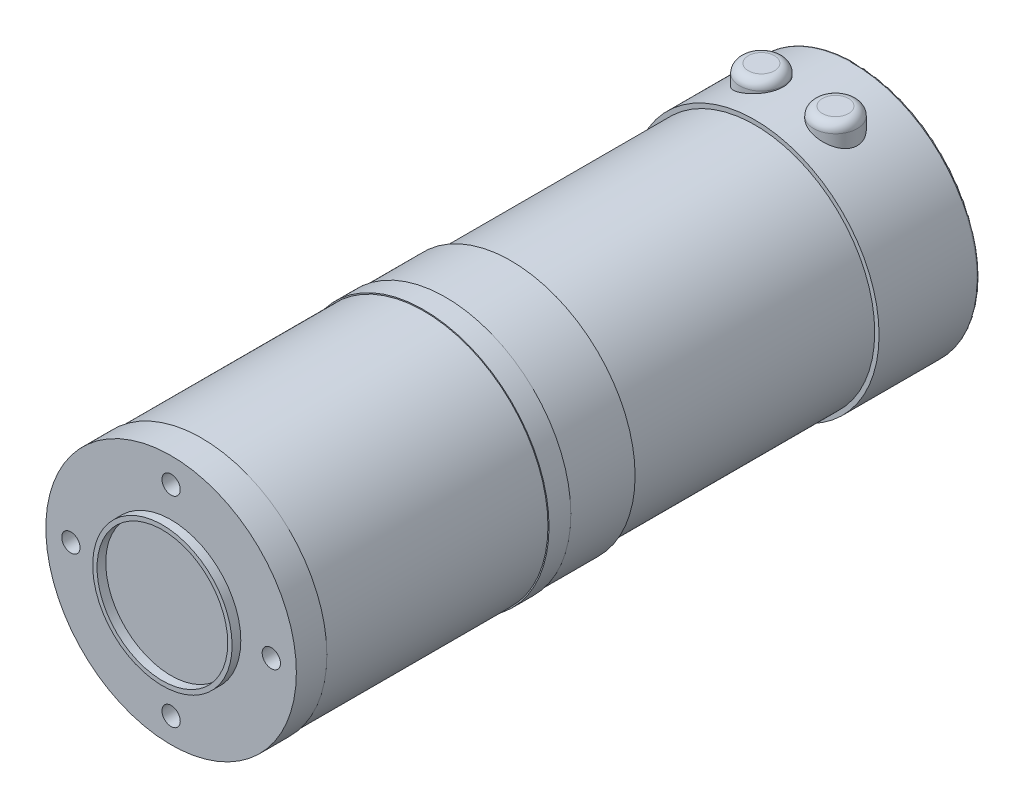
ISO-10303-21;
HEADER;
FILE_DESCRIPTION(('STEP AP214'),'2;1');
FILE_NAME('part.step','',(''),(''),'','','');
FILE_SCHEMA(('AUTOMOTIVE_DESIGN { 1 0 10303 214 1 1 1 1 }'));
ENDSEC;
DATA;
#1=APPLICATION_CONTEXT('core data for automotive mechanical design processes');
#2=APPLICATION_PROTOCOL_DEFINITION('international standard','automotive_design',2000,#1);
#3=PRODUCT_CONTEXT('',#1,'mechanical');
#4=PRODUCT('Part','Part','',(#3));
#5=PRODUCT_RELATED_PRODUCT_CATEGORY('part','',(#4));
#6=PRODUCT_DEFINITION_FORMATION('','',#4);
#7=PRODUCT_DEFINITION_CONTEXT('part definition',#1,'design');
#8=PRODUCT_DEFINITION('design','',#6,#7);
#9=PRODUCT_DEFINITION_SHAPE('','',#8);
#10=(LENGTH_UNIT() NAMED_UNIT(*) SI_UNIT(.MILLI.,.METRE.));
#11=(NAMED_UNIT(*) PLANE_ANGLE_UNIT() SI_UNIT($,.RADIAN.));
#12=(NAMED_UNIT(*) SI_UNIT($,.STERADIAN.) SOLID_ANGLE_UNIT());
#13=UNCERTAINTY_MEASURE_WITH_UNIT(LENGTH_MEASURE(1.E-05),#10,'distance_accuracy_value','');
#14=(GEOMETRIC_REPRESENTATION_CONTEXT(3) GLOBAL_UNCERTAINTY_ASSIGNED_CONTEXT((#13)) GLOBAL_UNIT_ASSIGNED_CONTEXT((#10,
#11,#12)) REPRESENTATION_CONTEXT('',''));
#15=CARTESIAN_POINT('',(0.,0.,0.));
#16=DIRECTION('',(0.,0.,1.));
#17=DIRECTION('',(1.,0.,0.));
#18=AXIS2_PLACEMENT_3D('',#15,#16,#17);
#19=CARTESIAN_POINT('',(0.,0.,23.));
#20=DIRECTION('',(0.,0.,-1.));
#21=DIRECTION('',(-1.,0.,0.));
#22=AXIS2_PLACEMENT_3D('',#19,#20,#21);
#23=CYLINDRICAL_SURFACE('',#22,28.5);
#24=CARTESIAN_POINT('',(8.5,27.2029410174709,18.));
#25=CARTESIAN_POINT('',(8.2215980023257,27.2899288025535,17.9999928920093));
#26=CARTESIAN_POINT('',(7.94175455463476,27.3726393053829,17.9766936688537));
#27=CARTESIAN_POINT('',(7.38702584232357,27.5275291059472,17.8826686358344));
#28=CARTESIAN_POINT('',(7.11214218859442,27.5997050342584,17.8119276923052));
#29=CARTESIAN_POINT('',(6.57540973267578,27.732482006058,17.6235207777951));
#30=CARTESIAN_POINT('',(6.3135820941252,27.7930646809322,17.5057812371101));
#31=CARTESIAN_POINT('',(5.81213291778889,27.9022406462446,17.2258478128532));
#32=CARTESIAN_POINT('',(5.57250769890732,27.9508359263866,17.063661316167));
#33=CARTESIAN_POINT('',(5.13036785518342,28.0353096235172,16.7046265894163));
#34=CARTESIAN_POINT('',(4.92695853245409,28.0715245365877,16.508958414972));
#35=CARTESIAN_POINT('',(4.55534602461994,28.1342216143982,16.0853008481876));
#36=CARTESIAN_POINT('',(4.38714033157915,28.1607044725595,15.857313760216));
#37=CARTESIAN_POINT('',(4.09366047527898,28.204852566088,15.3794088848876));
#38=CARTESIAN_POINT('',(3.96775566879824,28.2226493029743,15.1298901229276));
#39=CARTESIAN_POINT('',(3.75913612694643,28.2511954685276,14.6130317614181));
#40=CARTESIAN_POINT('',(3.67642072233359,28.2619450063952,14.3456924380797));
#41=CARTESIAN_POINT('',(3.55674247638711,28.2772568808793,13.8011422091777));
#42=CARTESIAN_POINT('',(3.51972324755044,28.2818268435445,13.523943904909));
#43=CARTESIAN_POINT('',(3.49234593187339,28.2852208603011,12.9672158688755));
#44=CARTESIAN_POINT('',(3.50198815986978,28.2840448756232,12.6876861213926));
#45=CARTESIAN_POINT('',(3.56768322963313,28.2758326561016,12.133936280986));
#46=CARTESIAN_POINT('',(3.62378255946918,28.2687905511858,11.8597217882658));
#47=CARTESIAN_POINT('',(3.78077844725276,28.2482199536616,11.3246875940557));
#48=CARTESIAN_POINT('',(3.88167458960516,28.234691521229,11.0638677683239));
#49=CARTESIAN_POINT('',(4.12514480027641,28.2001456216817,10.5631809923704));
#50=CARTESIAN_POINT('',(4.26769592220469,28.1791322763733,10.3233026004218));
#51=CARTESIAN_POINT('',(4.59010280470923,28.1284107514337,9.87113468534313));
#52=CARTESIAN_POINT('',(4.76995717226081,28.0987028964668,9.65884413247473));
#53=CARTESIAN_POINT('',(5.16122938959032,28.0294676919833,9.26783439845957));
#54=CARTESIAN_POINT('',(5.37262857825648,27.9899461388822,9.08909550921673));
#55=CARTESIAN_POINT('',(5.82042139361639,27.9002643849483,8.76969258028937));
#56=CARTESIAN_POINT('',(6.0568149207809,27.8501042264784,8.62902838899661));
#57=CARTESIAN_POINT('',(6.54927373225259,27.7384425411735,8.38801285772151));
#58=CARTESIAN_POINT('',(6.8054819453155,27.6768530398525,8.28799485643057));
#59=CARTESIAN_POINT('',(7.32820459405546,27.5430609841584,8.13159559291751));
#60=CARTESIAN_POINT('',(7.59472031634745,27.4708571016944,8.07521979682737));
#61=CARTESIAN_POINT('',(8.13866731132534,27.3147302419548,8.00531658776753));
#62=CARTESIAN_POINT('',(8.41618669140292,27.230521414967,7.99312074054481));
#63=CARTESIAN_POINT('',(8.96692022728644,27.0541688199638,8.01422049783395));
#64=CARTESIAN_POINT('',(9.24013327228207,26.9620230430087,8.04752765160574));
#65=CARTESIAN_POINT('',(9.78947466045829,26.7676170932278,8.16059377829724));
#66=CARTESIAN_POINT('',(10.0650336049574,26.6650805525536,8.24264797509598));
#67=CARTESIAN_POINT('',(10.5974876181209,26.4579861587864,8.45219547755334));
#68=CARTESIAN_POINT('',(10.8543762577636,26.353427624975,8.57970434687915));
#69=CARTESIAN_POINT('',(11.3536419431518,26.1423249483254,8.88351198200938));
#70=CARTESIAN_POINT('',(11.594977544702,26.0358778789205,9.06161249689401));
#71=CARTESIAN_POINT('',(11.9314983939501,25.8825175409181,9.36030019221266));
#72=CARTESIAN_POINT('',(12.0394876537895,25.8324182137753,9.46519844453498));
#73=CARTESIAN_POINT('',(12.2461368335703,25.7350952351465,9.6850077000052));
#74=CARTESIAN_POINT('',(12.3448012161735,25.68787021198,9.79991386249444));
#75=CARTESIAN_POINT('',(12.5298647400655,25.5981025088198,10.0365119599594));
#76=CARTESIAN_POINT('',(12.616484463665,25.5554801675457,10.1580012247675));
#77=CARTESIAN_POINT('',(12.7790436716005,25.4745810781106,10.4092179640949));
#78=CARTESIAN_POINT('',(12.85498841136,25.4363021934152,10.5389413388778));
#79=CARTESIAN_POINT('',(12.9953340060611,25.364887075107,10.8057613434494));
#80=CARTESIAN_POINT('',(13.0597406027344,25.3317482847343,10.9428542615232));
#81=CARTESIAN_POINT('',(13.1762041789068,25.2713662579139,11.2234368302694));
#82=CARTESIAN_POINT('',(13.2282627961067,25.2441222396902,11.3669256296598));
#83=CARTESIAN_POINT('',(13.3146540722985,25.1986531731305,11.6442657852441));
#84=CARTESIAN_POINT('',(13.3502480464709,25.1797941288685,11.7776212880751));
#85=CARTESIAN_POINT('',(13.4103762301415,25.1478224284268,12.0474732582856));
#86=CARTESIAN_POINT('',(13.4349117746185,25.1347090786295,12.1839693444402));
#87=CARTESIAN_POINT('',(13.4725690151559,25.1145444237488,12.4588923407664));
#88=CARTESIAN_POINT('',(13.4856972004214,25.10748967219,12.5973181076179));
#89=CARTESIAN_POINT('',(13.5003683756773,25.0996040968057,12.8749562909521));
#90=CARTESIAN_POINT('',(13.5019121406375,25.0987728566423,13.0141686541898));
#91=CARTESIAN_POINT('',(13.4938030936532,25.1031330886353,13.2788369878823));
#92=CARTESIAN_POINT('',(13.4852060781091,25.1077566486268,13.4043363322296));
#93=CARTESIAN_POINT('',(13.4586228384315,25.1220162288301,13.654090084273));
#94=CARTESIAN_POINT('',(13.440633666539,25.1316538227096,13.7783440886294));
#95=CARTESIAN_POINT('',(13.3954848495499,25.1557476113696,14.0246458000967));
#96=CARTESIAN_POINT('',(13.3683286780004,25.1702019809574,14.1466943244777));
#97=CARTESIAN_POINT('',(13.3051376596714,25.2036622100635,14.3878764514484));
#98=CARTESIAN_POINT('',(13.2690994148701,25.222669811437,14.5070089192197));
#99=CARTESIAN_POINT('',(13.1883961326471,25.2649616378224,14.7419567760508));
#100=CARTESIAN_POINT('',(13.1437048280362,25.2882588735955,14.857760799791));
#101=CARTESIAN_POINT('',(13.0461963698654,25.3387010908877,15.0850447985533));
#102=CARTESIAN_POINT('',(12.9933763417157,25.3658474333123,15.1965232263687));
#103=CARTESIAN_POINT('',(12.8234129754748,25.4524310494731,15.5235632886326));
#104=CARTESIAN_POINT('',(12.6947108002082,25.5170424979063,15.7318896154191));
#105=CARTESIAN_POINT('',(12.3975400242522,25.6628279719875,16.1431401736648));
#106=CARTESIAN_POINT('',(12.2265243422875,25.7449724128939,16.3438631807368));
#107=CARTESIAN_POINT('',(11.8571808501461,25.9171524389797,16.7145446271887));
#108=CARTESIAN_POINT('',(11.6588361409801,26.0071928940623,16.8844838796634));
#109=CARTESIAN_POINT('',(11.2177074878708,26.2007020320161,17.2066812569164));
#110=CARTESIAN_POINT('',(10.9724496797748,26.3045973281632,17.355302470483));
#111=CARTESIAN_POINT('',(10.4603093879406,26.5124154503182,17.6085497756248));
#112=CARTESIAN_POINT('',(10.193435476353,26.6163382492809,17.7131932062725));
#113=CARTESIAN_POINT('',(9.69032777534815,26.80311800234,17.8620972748089));
#114=CARTESIAN_POINT('',(9.45642155751411,26.8865942704103,17.9135241449755));
#115=CARTESIAN_POINT('',(8.98203814915032,27.0487670767706,17.9824767480379));
#116=CARTESIAN_POINT('',(8.74156167604498,27.1274641339157,18.000006167406));
#117=CARTESIAN_POINT('',(8.5,27.2029410174709,18.));
#118=B_SPLINE_CURVE_WITH_KNOTS('',3,(#24,#25,#26,#27,#28,#29,#30,#31,#32,#33,#34,#35,#36,#37,
#38,#39,#40,#41,#42,#43,#44,#45,#46,#47,#48,#49,#50,#51,#52,#53,#54,#55,#56,#57,#58,#59,#60,#61,
#62,#63,#64,#65,#66,#67,#68,#69,#70,#71,#72,#73,#74,#75,#76,#77,#78,#79,#80,#81,#82,#83,#84,#85,
#86,#87,#88,#89,#90,#91,#92,#93,#94,#95,#96,#97,#98,#99,#100,#101,#102,#103,#104,#105,#106,#107,
#108,#109,#110,#111,#112,#113,#114,#115,#116,#117),.UNSPECIFIED.,.T.,.F.,(4,2,2,2,2,2,2,2,2,2,2,
2,2,2,2,2,2,2,2,2,2,2,2,2,2,2,2,2,2,2,2,2,2,2,2,2,2,2,2,2,2,2,2,2,2,2,4),(0.,0.874177967971466,
1.74863492695517,2.62446612736889,3.50015185672895,4.34968077218183,5.19914914586946,
6.03532419335278,6.8714862834934,7.70661554369903,8.54175043874284,9.37772203660897,
10.213685879047,11.0491900811986,11.8846630885178,12.7196437964796,13.5546211796138,
14.3963143423812,15.2381129091228,16.1050812268963,16.9722696335142,17.8839427834489,
18.7959283903153,19.7456795635049,20.2211821707362,20.69645604917,21.1613636260605,
21.6260415156301,22.0904875210633,22.5548718929723,22.9722215658475,23.3895208425654,
23.8065825781722,24.223616413103,24.6008004560468,24.9781029506665,25.355262638519,
25.7325668412339,26.1110348710976,26.4896370488345,27.2463314495812,28.0716135194763,
28.8974082146466,29.808461310375,30.719154868442,31.4777372993985,32.2362372270888),.UNSPECIFIED.);
#119=CARTESIAN_POINT('',(8.5,27.2029410174709,18.));
#120=VERTEX_POINT('',#119);
#121=EDGE_CURVE('E181',#120,#120,#118,.T.);
#122=ORIENTED_EDGE('',*,*,#121,.T.);
#123=EDGE_LOOP('',(#122));
#124=FACE_BOUND('',#123,.T.);
#125=CARTESIAN_POINT('',(-8.5,27.2029410174709,18.));
#126=CARTESIAN_POINT('',(-8.64924360895502,27.1563082781333,18.0000020822168));
#127=CARTESIAN_POINT('',(-8.7980797950903,27.1084501154729,17.9933160082815));
#128=CARTESIAN_POINT('',(-9.09394056446113,27.0106371592633,17.9668195167791));
#129=CARTESIAN_POINT('',(-9.24096454301619,26.9606816891597,17.9470048332091));
#130=CARTESIAN_POINT('',(-9.53229865262949,26.8590599398906,17.8945162730105));
#131=CARTESIAN_POINT('',(-9.67660539695412,26.8073917221101,17.8618273352215));
#132=CARTESIAN_POINT('',(-9.96139103994587,26.7028792171195,17.7839476370802));
#133=CARTESIAN_POINT('',(-10.1018684470595,26.6500344858073,17.7387520796385));
#134=CARTESIAN_POINT('',(-10.5155727333695,26.490745158071,17.5851701340718));
#135=CARTESIAN_POINT('',(-10.7818925793802,26.3832570138501,17.4586384136612));
#136=CARTESIAN_POINT('',(-11.2888309158307,26.1703647872072,17.1603965229008));
#137=CARTESIAN_POINT('',(-11.5294523460874,26.0649604675289,16.9886915280295));
#138=CARTESIAN_POINT('',(-11.8677774106484,25.9118046332387,16.6987346944997));
#139=CARTESIAN_POINT('',(-11.9775461890045,25.8612048000989,16.5957531933063));
#140=CARTESIAN_POINT('',(-12.1879101386585,25.7627307386385,16.3796489913635));
#141=CARTESIAN_POINT('',(-12.2885092184271,25.7148553523562,16.2665306524751));
#142=CARTESIAN_POINT('',(-12.479675529626,25.6226263184126,16.0307152319445));
#143=CARTESIAN_POINT('',(-12.5702396147304,25.5782737765149,15.9080151665331));
#144=CARTESIAN_POINT('',(-12.7403336039364,25.4939778220535,15.6538525766229));
#145=CARTESIAN_POINT('',(-12.819869639448,25.4540319619945,15.5223949818446));
#146=CARTESIAN_POINT('',(-12.9624744274078,25.3816913012874,15.2599185888973));
#147=CARTESIAN_POINT('',(-13.0262568667446,25.3489824962222,15.1293742079769));
#148=CARTESIAN_POINT('',(-13.1425457549952,25.2888864295719,14.8622493332317));
#149=CARTESIAN_POINT('',(-13.1950582106929,25.2614963339148,14.7256721018964));
#150=CARTESIAN_POINT('',(-13.2881167612304,25.2126697652083,14.447558501297));
#151=CARTESIAN_POINT('',(-13.3286704344536,25.1912295221959,14.3060253365529));
#152=CARTESIAN_POINT('',(-13.3972529697741,25.1548231353536,14.0191443211545));
#153=CARTESIAN_POINT('',(-13.4252834004192,25.1398561807458,13.8737969506486));
#154=CARTESIAN_POINT('',(-13.4659302394958,25.1181047610407,13.5973162764345));
#155=CARTESIAN_POINT('',(-13.4799355710843,25.1105841130146,13.466443170724));
#156=CARTESIAN_POINT('',(-13.4975776724979,25.1011055538745,13.2038026608659));
#157=CARTESIAN_POINT('',(-13.5012152314133,25.0991472194134,13.0720353255434));
#158=CARTESIAN_POINT('',(-13.4980735132609,25.1008369168597,12.8086977410913));
#159=CARTESIAN_POINT('',(-13.4912970083546,25.1044834567831,12.6771274488414));
#160=CARTESIAN_POINT('',(-13.4674244666174,25.11729803729,12.4152015843965));
#161=CARTESIAN_POINT('',(-13.4503285567681,25.1264660099316,12.2848459972744));
#162=CARTESIAN_POINT('',(-13.4072932559956,25.1494541986958,12.033682079912));
#163=CARTESIAN_POINT('',(-13.3819098827964,25.1629813534486,11.9127513200028));
#164=CARTESIAN_POINT('',(-13.3224427782881,25.1945160918055,11.6736332500751));
#165=CARTESIAN_POINT('',(-13.2883562618105,25.2125251096429,11.5554468315304));
#166=CARTESIAN_POINT('',(-13.1735524572793,25.2728125904437,11.2061640693539));
#167=CARTESIAN_POINT('',(-13.0802553168357,25.3213708961298,10.9801399923126));
#168=CARTESIAN_POINT('',(-12.8581107855449,25.4349212422181,10.5359141008195));
#169=CARTESIAN_POINT('',(-12.7277083338772,25.5006183372673,10.3186810378524));
#170=CARTESIAN_POINT('',(-12.4378527425277,25.6432428359524,9.90865819491186));
#171=CARTESIAN_POINT('',(-12.278387653049,25.7201748565009,9.71587852503832));
#172=CARTESIAN_POINT('',(-11.9161241512914,25.8901534128528,9.33864132454977));
#173=CARTESIAN_POINT('',(-11.7105194323811,25.9840435623014,9.15725666047809));
#174=CARTESIAN_POINT('',(-11.2739703204511,26.1764130201644,8.83113410700612));
#175=CARTESIAN_POINT('',(-11.0430144579173,26.2748943940799,8.68641290386813));
#176=CARTESIAN_POINT('',(-10.5406650056825,26.4806284864493,8.42593471538105));
#177=CARTESIAN_POINT('',(-10.267506324685,26.5879314494005,8.31357411691619));
#178=CARTESIAN_POINT('',(-9.84540099597757,26.7458574656194,8.18214654815929));
#179=CARTESIAN_POINT('',(-9.70254773045482,26.7980254085505,8.14451138605596));
#180=CARTESIAN_POINT('',(-9.41358357194509,26.9008900748082,8.08195351461785));
#181=CARTESIAN_POINT('',(-9.26747402652657,26.951587387454,8.0570256448767));
#182=CARTESIAN_POINT('',(-8.97159755851395,27.0515261355582,8.02003609514106));
#183=CARTESIAN_POINT('',(-8.82180917649945,27.1007494317328,8.00809741835192));
#184=CARTESIAN_POINT('',(-8.52106469329972,27.196807842487,7.99778243441376));
#185=CARTESIAN_POINT('',(-8.3701091061907,27.2436439463593,7.99940046239785));
#186=CARTESIAN_POINT('',(-8.06811528460508,27.3346006102407,8.01639159811183));
#187=CARTESIAN_POINT('',(-7.91707703959418,27.3787206199088,8.0317674837484));
#188=CARTESIAN_POINT('',(-7.61626242425552,27.4639212302897,8.07637187835202));
#189=CARTESIAN_POINT('',(-7.46648549479039,27.5050032482277,8.10559388036316));
#190=CARTESIAN_POINT('',(-7.17638797263865,27.5820760687022,8.17617554419714));
#191=CARTESIAN_POINT('',(-7.03595285016367,27.6182151550002,8.21690322766037));
#192=CARTESIAN_POINT('',(-6.75857542400503,27.6873992950545,8.31077123840541));
#193=CARTESIAN_POINT('',(-6.62163162874823,27.7204456867596,8.36390616301989));
#194=CARTESIAN_POINT('',(-6.35235815857843,27.7833883164775,8.48233822673846));
#195=CARTESIAN_POINT('',(-6.22002837238216,27.8132846305008,8.54763507227328));
#196=CARTESIAN_POINT('',(-5.96115242066411,27.8699160182357,8.69000329110914));
#197=CARTESIAN_POINT('',(-5.83460605572886,27.8966512009942,8.7670742580377));
#198=CARTESIAN_POINT('',(-5.59448466544568,27.9457692572935,8.92840754167268));
#199=CARTESIAN_POINT('',(-5.48057783411233,27.9683013519084,9.01213116353867));
#200=CARTESIAN_POINT('',(-5.25992390006993,28.0106377457738,9.18923552916823));
#201=CARTESIAN_POINT('',(-5.15317926508173,28.0304411072956,9.28261957352879));
#202=CARTESIAN_POINT('',(-4.94782923323015,28.0674164936953,9.47832549756525));
#203=CARTESIAN_POINT('',(-4.8492199881705,28.0845897659864,9.5806431038015));
#204=CARTESIAN_POINT('',(-4.66086439326333,28.1164626713463,9.79356154552609));
#205=CARTESIAN_POINT('',(-4.57112130195079,28.1311613963437,9.90416540035381));
#206=CARTESIAN_POINT('',(-4.4032143549891,28.1579254962674,10.1302061910252));
#207=CARTESIAN_POINT('',(-4.32483338129785,28.1700432085929,10.2454757480478));
#208=CARTESIAN_POINT('',(-4.17786507638273,28.1922147211821,10.4823457173101));
#209=CARTESIAN_POINT('',(-4.10928131289841,28.202267770161,10.603948413932));
#210=CARTESIAN_POINT('',(-3.98249804311837,28.2204502338199,10.852528177867));
#211=CARTESIAN_POINT('',(-3.92429444791327,28.2285804063641,10.9795031044806));
#212=CARTESIAN_POINT('',(-3.81866445991916,28.2430636936258,11.2380122332171));
#213=CARTESIAN_POINT('',(-3.77124205633086,28.2494161507623,11.3695481022759));
#214=CARTESIAN_POINT('',(-3.68772610383691,28.2604395737099,11.635671149894));
#215=CARTESIAN_POINT('',(-3.65158903287904,28.2651170097724,11.7702444050552));
#216=CARTESIAN_POINT('',(-3.5906522108061,28.2729227667498,12.0420298222763));
#217=CARTESIAN_POINT('',(-3.56585663515947,28.2760505171699,12.1792429368809));
#218=CARTESIAN_POINT('',(-3.52781443299802,28.2808220173269,12.455236247675));
#219=CARTESIAN_POINT('',(-3.51456362933148,28.2824663038212,12.5940158586461));
#220=CARTESIAN_POINT('',(-3.49968985498023,28.2843105891485,12.8722552498247));
#221=CARTESIAN_POINT('',(-3.49807118202793,28.2845100541625,13.0117152623792));
#222=CARTESIAN_POINT('',(-3.50649311586014,28.2834674508415,13.2903859117039));
#223=CARTESIAN_POINT('',(-3.51654195556743,28.2822243646024,13.4295963028775));
#224=CARTESIAN_POINT('',(-3.54822457535099,28.2782660314827,13.7066853262142));
#225=CARTESIAN_POINT('',(-3.56986263447595,28.2755502408357,13.8445634473127));
#226=CARTESIAN_POINT('',(-3.6519641617129,28.2651092827134,14.2546123634402));
#227=CARTESIAN_POINT('',(-3.72962444125665,28.2550896345709,14.5235009803375));
#228=CARTESIAN_POINT('',(-3.92842788574137,28.2281311887632,15.0441332017084));
#229=CARTESIAN_POINT('',(-4.04956749895323,28.211192956246,15.2958782046075));
#230=CARTESIAN_POINT('',(-4.33164716539462,28.1692579190629,15.7752695299067));
#231=CARTESIAN_POINT('',(-4.49258468310956,28.1442616277433,16.0029173862111));
#232=CARTESIAN_POINT('',(-4.84905288600336,28.0850350759595,16.427439130581));
#233=CARTESIAN_POINT('',(-5.0445440116408,28.0508153518968,16.624347730844));
#234=CARTESIAN_POINT('',(-5.4641522805256,27.9721023000481,16.9824240003421));
#235=CARTESIAN_POINT('',(-5.68827441787372,27.9276071788306,17.1435854207531));
#236=CARTESIAN_POINT('',(-6.15922233386458,27.8275434506052,17.4268120261834));
#237=CARTESIAN_POINT('',(-6.40615286827158,27.7719222278788,17.5486839718421));
#238=CARTESIAN_POINT('',(-6.91409975760811,27.6498322591451,17.74967391674));
#239=CARTESIAN_POINT('',(-7.17510367269425,27.5833729912843,17.8288290146203));
#240=CARTESIAN_POINT('',(-7.61454344507796,27.464557133251,17.9242486699327));
#241=CARTESIAN_POINT('',(-7.79120193794297,27.4149827770313,17.9527137541045));
#242=CARTESIAN_POINT('',(-8.1454313099989,27.3118271128535,17.9905880693721));
#243=CARTESIAN_POINT('',(-8.32300217814706,27.2582458532865,17.9999975305621));
#244=CARTESIAN_POINT('',(-8.5,27.2029410174709,18.));
#245=B_SPLINE_CURVE_WITH_KNOTS('',3,(#125,#126,#127,#128,#129,#130,#131,#132,#133,#134,#135,
#136,#137,#138,#139,#140,#141,#142,#143,#144,#145,#146,#147,#148,#149,#150,#151,#152,#153,#154,
#155,#156,#157,#158,#159,#160,#161,#162,#163,#164,#165,#166,#167,#168,#169,#170,#171,#172,#173,
#174,#175,#176,#177,#178,#179,#180,#181,#182,#183,#184,#185,#186,#187,#188,#189,#190,#191,#192,
#193,#194,#195,#196,#197,#198,#199,#200,#201,#202,#203,#204,#205,#206,#207,#208,#209,#210,#211,
#212,#213,#214,#215,#216,#217,#218,#219,#220,#221,#222,#223,#224,#225,#226,#227,#228,#229,#230,
#231,#232,#233,#234,#235,#236,#237,#238,#239,#240,#241,#242,#243,#244),.UNSPECIFIED.,.T.,.F.,(4,
2,2,2,2,2,2,2,2,2,2,2,2,2,2,2,2,2,2,2,2,2,2,2,2,2,2,2,2,2,2,2,2,2,2,2,2,2,2,2,2,2,2,2,2,2,2,2,2,
2,2,2,2,2,2,2,2,2,2,4),(0.,0.468893775157338,0.937939987160492,1.40753655842344,
1.87731350030067,2.81425150692654,3.75108221576392,4.22694604914728,4.70260609358388,
5.17841485477066,5.6539580043274,6.10012863107679,6.54606085968369,6.99170988690174,
7.43730308050665,7.83229551454448,8.22725788493981,8.62211513692494,9.01696753024344,
9.38944531119412,9.76204244172704,10.5066193901213,11.2887320691803,12.0711670610388,
12.9369314350102,13.8030891303669,14.7410622528073,15.2106179203964,15.6799827501422,
16.1537546249245,16.6273285370927,17.1009980921372,17.5744452675256,18.0257372580357,
18.4768331011027,18.9279180568508,19.3789874473506,19.8079155623198,20.23699071269,
20.6658617244666,21.0948897753201,21.5141495327446,21.9335615801693,22.3528080479975,
22.7722093916655,23.1899727426851,23.6078897733025,24.0256555295006,24.4435756300069,
24.8617908059177,25.280160504577,26.1160011206881,26.9517734743902,27.7874925949552,
28.6222610473607,29.4571753075625,30.296135445934,31.1343657885236,31.6904645026593,
32.2465565019373),.UNSPECIFIED.);
#246=CARTESIAN_POINT('',(-8.5,27.2029410174709,18.));
#247=VERTEX_POINT('',#246);
#248=EDGE_CURVE('E82',#247,#247,#245,.T.);
#249=ORIENTED_EDGE('',*,*,#248,.T.);
#250=EDGE_LOOP('',(#249));
#251=FACE_BOUND('',#250,.T.);
#252=CARTESIAN_POINT('',(0.,0.,0.5));
#253=DIRECTION('',(0.,0.,1.));
#254=DIRECTION('',(1.,0.,0.));
#255=AXIS2_PLACEMENT_3D('',#252,#253,#254);
#256=CIRCLE('',#255,28.5);
#257=CARTESIAN_POINT('',(28.5,0.,0.5));
#258=VERTEX_POINT('',#257);
#259=EDGE_CURVE('E160',#258,#258,#256,.T.);
#260=ORIENTED_EDGE('',*,*,#259,.T.);
#261=EDGE_LOOP('',(#260));
#262=FACE_BOUND('',#261,.T.);
#263=CARTESIAN_POINT('',(0.,0.,23.));
#264=DIRECTION('',(0.,0.,1.));
#265=DIRECTION('',(1.,0.,0.));
#266=AXIS2_PLACEMENT_3D('',#263,#264,#265);
#267=CIRCLE('',#266,28.5);
#268=CARTESIAN_POINT('',(28.5,0.,23.));
#269=VERTEX_POINT('',#268);
#270=EDGE_CURVE('E153',#269,#269,#267,.T.);
#271=ORIENTED_EDGE('',*,*,#270,.F.);
#272=EDGE_LOOP('',(#271));
#273=FACE_BOUND('',#272,.T.);
#274=ADVANCED_FACE('F40',(#124,#251,#262,#273),#23,.T.);
#275=CARTESIAN_POINT('',(0.,0.,23.));
#276=DIRECTION('',(0.,0.,1.));
#277=DIRECTION('',(1.,0.,0.));
#278=AXIS2_PLACEMENT_3D('',#275,#276,#277);
#279=PLANE('',#278);
#280=CARTESIAN_POINT('',(0.,0.,23.));
#281=DIRECTION('',(0.,0.,1.));
#282=DIRECTION('',(1.,0.,0.));
#283=AXIS2_PLACEMENT_3D('',#280,#281,#282);
#284=CIRCLE('',#283,27.5);
#285=CARTESIAN_POINT('',(27.5,0.,23.));
#286=VERTEX_POINT('',#285);
#287=EDGE_CURVE('E145',#286,#286,#284,.T.);
#288=ORIENTED_EDGE('',*,*,#287,.F.);
#289=EDGE_LOOP('',(#288));
#290=FACE_BOUND('',#289,.T.);
#291=ORIENTED_EDGE('',*,*,#270,.T.);
#292=EDGE_LOOP('',(#291));
#293=FACE_BOUND('',#292,.T.);
#294=ADVANCED_FACE('F275',(#290,#293),#279,.T.);
#295=CARTESIAN_POINT('',(0.,0.,0.));
#296=DIRECTION('',(0.,0.,1.));
#297=DIRECTION('',(1.,0.,0.));
#298=AXIS2_PLACEMENT_3D('',#295,#296,#297);
#299=PLANE('',#298);
#300=CARTESIAN_POINT('',(0.,0.,0.));
#301=DIRECTION('',(0.,0.,1.));
#302=DIRECTION('',(1.,0.,0.));
#303=AXIS2_PLACEMENT_3D('',#300,#301,#302);
#304=CIRCLE('',#303,28.);
#305=CARTESIAN_POINT('',(28.,0.,0.));
#306=VERTEX_POINT('',#305);
#307=EDGE_CURVE('E164',#306,#306,#304,.F.);
#308=ORIENTED_EDGE('',*,*,#307,.T.);
#309=EDGE_LOOP('',(#308));
#310=FACE_BOUND('',#309,.T.);
#311=ADVANCED_FACE('F273',(#310),#299,.F.);
#312=CARTESIAN_POINT('',(0.,0.,79.));
#313=DIRECTION('',(0.,0.,-1.));
#314=DIRECTION('',(-1.,0.,0.));
#315=AXIS2_PLACEMENT_3D('',#312,#313,#314);
#316=CYLINDRICAL_SURFACE('',#315,27.5);
#317=CARTESIAN_POINT('',(0.,0.,79.));
#318=DIRECTION('',(0.,0.,1.));
#319=DIRECTION('',(1.,0.,0.));
#320=AXIS2_PLACEMENT_3D('',#317,#318,#319);
#321=CIRCLE('',#320,27.5);
#322=CARTESIAN_POINT('',(27.5,0.,79.));
#323=VERTEX_POINT('',#322);
#324=EDGE_CURVE('E149',#323,#323,#321,.T.);
#325=ORIENTED_EDGE('',*,*,#324,.F.);
#326=EDGE_LOOP('',(#325));
#327=FACE_BOUND('',#326,.T.);
#328=ORIENTED_EDGE('',*,*,#287,.T.);
#329=EDGE_LOOP('',(#328));
#330=FACE_BOUND('',#329,.T.);
#331=ADVANCED_FACE('F269',(#327,#330),#316,.T.);
#332=CARTESIAN_POINT('',(0.,0.,94.));
#333=DIRECTION('',(0.,0.,-1.));
#334=DIRECTION('',(-1.,0.,0.));
#335=AXIS2_PLACEMENT_3D('',#332,#333,#334);
#336=CYLINDRICAL_SURFACE('',#335,28.5);
#337=CARTESIAN_POINT('',(0.,0.,94.));
#338=DIRECTION('',(0.,0.,1.));
#339=DIRECTION('',(1.,0.,0.));
#340=AXIS2_PLACEMENT_3D('',#337,#338,#339);
#341=CIRCLE('',#340,28.5);
#342=CARTESIAN_POINT('',(28.5,0.,94.));
#343=VERTEX_POINT('',#342);
#344=EDGE_CURVE('E141',#343,#343,#341,.T.);
#345=ORIENTED_EDGE('',*,*,#344,.F.);
#346=EDGE_LOOP('',(#345));
#347=FACE_BOUND('',#346,.T.);
#348=CARTESIAN_POINT('',(0.,0.,79.));
#349=DIRECTION('',(0.,0.,1.));
#350=DIRECTION('',(1.,0.,0.));
#351=AXIS2_PLACEMENT_3D('',#348,#349,#350);
#352=CIRCLE('',#351,28.5);
#353=CARTESIAN_POINT('',(28.5,0.,79.));
#354=VERTEX_POINT('',#353);
#355=EDGE_CURVE('E137',#354,#354,#352,.T.);
#356=ORIENTED_EDGE('',*,*,#355,.T.);
#357=EDGE_LOOP('',(#356));
#358=FACE_BOUND('',#357,.T.);
#359=ADVANCED_FACE('F265',(#347,#358),#336,.T.);
#360=CARTESIAN_POINT('',(0.,0.,79.));
#361=DIRECTION('',(0.,0.,1.));
#362=DIRECTION('',(1.,0.,0.));
#363=AXIS2_PLACEMENT_3D('',#360,#361,#362);
#364=PLANE('',#363);
#365=ORIENTED_EDGE('',*,*,#324,.T.);
#366=EDGE_LOOP('',(#365));
#367=FACE_BOUND('',#366,.T.);
#368=ORIENTED_EDGE('',*,*,#355,.F.);
#369=EDGE_LOOP('',(#368));
#370=FACE_BOUND('',#369,.T.);
#371=ADVANCED_FACE('F261',(#367,#370),#364,.F.);
#372=CARTESIAN_POINT('',(0.,0.,99.));
#373=DIRECTION('',(0.,0.,-1.));
#374=DIRECTION('',(-1.,0.,0.));
#375=AXIS2_PLACEMENT_3D('',#372,#373,#374);
#376=CYLINDRICAL_SURFACE('',#375,28.75);
#377=CARTESIAN_POINT('',(0.,0.,99.));
#378=DIRECTION('',(0.,0.,1.));
#379=DIRECTION('',(1.,0.,0.));
#380=AXIS2_PLACEMENT_3D('',#377,#378,#379);
#381=CIRCLE('',#380,28.75);
#382=CARTESIAN_POINT('',(28.75,0.,99.));
#383=VERTEX_POINT('',#382);
#384=EDGE_CURVE('E133',#383,#383,#381,.T.);
#385=ORIENTED_EDGE('',*,*,#384,.F.);
#386=EDGE_LOOP('',(#385));
#387=FACE_BOUND('',#386,.T.);
#388=CARTESIAN_POINT('',(0.,0.,94.));
#389=DIRECTION('',(0.,0.,1.));
#390=DIRECTION('',(1.,0.,0.));
#391=AXIS2_PLACEMENT_3D('',#388,#389,#390);
#392=CIRCLE('',#391,28.75);
#393=CARTESIAN_POINT('',(28.75,0.,94.));
#394=VERTEX_POINT('',#393);
#395=EDGE_CURVE('E129',#394,#394,#392,.T.);
#396=ORIENTED_EDGE('',*,*,#395,.T.);
#397=EDGE_LOOP('',(#396));
#398=FACE_BOUND('',#397,.T.);
#399=ADVANCED_FACE('F254',(#387,#398),#376,.T.);
#400=CARTESIAN_POINT('',(0.,0.,99.));
#401=DIRECTION('',(0.,0.,1.));
#402=DIRECTION('',(1.,0.,0.));
#403=AXIS2_PLACEMENT_3D('',#400,#401,#402);
#404=PLANE('',#403);
#405=CARTESIAN_POINT('',(0.,0.,99.));
#406=DIRECTION('',(0.,0.,1.));
#407=DIRECTION('',(1.,0.,0.));
#408=AXIS2_PLACEMENT_3D('',#405,#406,#407);
#409=CIRCLE('',#408,28.5);
#410=CARTESIAN_POINT('',(28.5,0.,99.));
#411=VERTEX_POINT('',#410);
#412=EDGE_CURVE('E121',#411,#411,#409,.T.);
#413=ORIENTED_EDGE('',*,*,#412,.F.);
#414=EDGE_LOOP('',(#413));
#415=FACE_BOUND('',#414,.T.);
#416=ORIENTED_EDGE('',*,*,#384,.T.);
#417=EDGE_LOOP('',(#416));
#418=FACE_BOUND('',#417,.T.);
#419=ADVANCED_FACE('F251',(#415,#418),#404,.T.);
#420=CARTESIAN_POINT('',(0.,0.,94.));
#421=DIRECTION('',(0.,0.,1.));
#422=DIRECTION('',(1.,0.,0.));
#423=AXIS2_PLACEMENT_3D('',#420,#421,#422);
#424=PLANE('',#423);
#425=ORIENTED_EDGE('',*,*,#344,.T.);
#426=EDGE_LOOP('',(#425));
#427=FACE_BOUND('',#426,.T.);
#428=ORIENTED_EDGE('',*,*,#395,.F.);
#429=EDGE_LOOP('',(#428));
#430=FACE_BOUND('',#429,.T.);
#431=ADVANCED_FACE('F249',(#427,#430),#424,.F.);
#432=CARTESIAN_POINT('',(0.,0.,150.));
#433=DIRECTION('',(0.,0.,-1.));
#434=DIRECTION('',(-1.,0.,0.));
#435=AXIS2_PLACEMENT_3D('',#432,#433,#434);
#436=CYLINDRICAL_SURFACE('',#435,28.5);
#437=CARTESIAN_POINT('',(0.,0.,150.));
#438=DIRECTION('',(0.,0.,1.));
#439=DIRECTION('',(1.,0.,0.));
#440=AXIS2_PLACEMENT_3D('',#437,#438,#439);
#441=CIRCLE('',#440,28.5);
#442=CARTESIAN_POINT('',(28.5,0.,150.));
#443=VERTEX_POINT('',#442);
#444=EDGE_CURVE('E125',#443,#443,#441,.T.);
#445=ORIENTED_EDGE('',*,*,#444,.F.);
#446=EDGE_LOOP('',(#445));
#447=FACE_BOUND('',#446,.T.);
#448=ORIENTED_EDGE('',*,*,#412,.T.);
#449=EDGE_LOOP('',(#448));
#450=FACE_BOUND('',#449,.T.);
#451=ADVANCED_FACE('F245',(#447,#450),#436,.T.);
#452=CARTESIAN_POINT('',(0.,0.,157.));
#453=DIRECTION('',(0.,0.,-1.));
#454=DIRECTION('',(-1.,0.,0.));
#455=AXIS2_PLACEMENT_3D('',#452,#453,#454);
#456=CYLINDRICAL_SURFACE('',#455,28.75);
#457=CARTESIAN_POINT('',(0.,0.,157.));
#458=DIRECTION('',(0.,0.,1.));
#459=DIRECTION('',(1.,0.,0.));
#460=AXIS2_PLACEMENT_3D('',#457,#458,#459);
#461=CIRCLE('',#460,28.75);
#462=CARTESIAN_POINT('',(28.75,0.,157.));
#463=VERTEX_POINT('',#462);
#464=EDGE_CURVE('E117',#463,#463,#461,.T.);
#465=ORIENTED_EDGE('',*,*,#464,.F.);
#466=EDGE_LOOP('',(#465));
#467=FACE_BOUND('',#466,.T.);
#468=CARTESIAN_POINT('',(0.,0.,150.));
#469=DIRECTION('',(0.,0.,1.));
#470=DIRECTION('',(1.,0.,0.));
#471=AXIS2_PLACEMENT_3D('',#468,#469,#470);
#472=CIRCLE('',#471,28.75);
#473=CARTESIAN_POINT('',(28.75,0.,150.));
#474=VERTEX_POINT('',#473);
#475=EDGE_CURVE('E113',#474,#474,#472,.T.);
#476=ORIENTED_EDGE('',*,*,#475,.T.);
#477=EDGE_LOOP('',(#476));
#478=FACE_BOUND('',#477,.T.);
#479=ADVANCED_FACE('F238',(#467,#478),#456,.T.);
#480=CARTESIAN_POINT('',(0.,0.,157.));
#481=DIRECTION('',(0.,0.,1.));
#482=DIRECTION('',(1.,0.,0.));
#483=AXIS2_PLACEMENT_3D('',#480,#481,#482);
#484=PLANE('',#483);
#485=CARTESIAN_POINT('',(-2.33444272615965E-13,-23.,157.));
#486=DIRECTION('',(0.,0.,1.));
#487=DIRECTION('',(1.,0.,0.));
#488=AXIS2_PLACEMENT_3D('',#485,#486,#487);
#489=CIRCLE('',#488,2.1);
#490=CARTESIAN_POINT('',(2.09999999999977,-23.,157.));
#491=VERTEX_POINT('',#490);
#492=EDGE_CURVE('E74',#491,#491,#489,.T.);
#493=ORIENTED_EDGE('',*,*,#492,.F.);
#494=EDGE_LOOP('',(#493));
#495=FACE_BOUND('',#494,.T.);
#496=CARTESIAN_POINT('',(23.,0.,157.));
#497=DIRECTION('',(0.,0.,1.));
#498=DIRECTION('',(1.,0.,0.));
#499=AXIS2_PLACEMENT_3D('',#496,#497,#498);
#500=CIRCLE('',#499,2.1);
#501=CARTESIAN_POINT('',(25.1,0.,157.));
#502=VERTEX_POINT('',#501);
#503=EDGE_CURVE('E73',#502,#502,#500,.T.);
#504=ORIENTED_EDGE('',*,*,#503,.F.);
#505=EDGE_LOOP('',(#504));
#506=FACE_BOUND('',#505,.T.);
#507=CARTESIAN_POINT('',(0.,23.,157.));
#508=DIRECTION('',(0.,0.,1.));
#509=DIRECTION('',(1.,0.,0.));
#510=AXIS2_PLACEMENT_3D('',#507,#508,#509);
#511=CIRCLE('',#510,2.1);
#512=CARTESIAN_POINT('',(2.10000000000007,23.,157.));
#513=VERTEX_POINT('',#512);
#514=EDGE_CURVE('E88',#513,#513,#511,.T.);
#515=ORIENTED_EDGE('',*,*,#514,.F.);
#516=EDGE_LOOP('',(#515));
#517=FACE_BOUND('',#516,.T.);
#518=CARTESIAN_POINT('',(-23.,0.,157.));
#519=DIRECTION('',(0.,0.,1.));
#520=DIRECTION('',(1.,0.,0.));
#521=AXIS2_PLACEMENT_3D('',#518,#519,#520);
#522=CIRCLE('',#521,2.1);
#523=CARTESIAN_POINT('',(-20.9,0.,157.));
#524=VERTEX_POINT('',#523);
#525=EDGE_CURVE('E96',#524,#524,#522,.T.);
#526=ORIENTED_EDGE('',*,*,#525,.F.);
#527=EDGE_LOOP('',(#526));
#528=FACE_BOUND('',#527,.T.);
#529=CARTESIAN_POINT('',(0.,0.,157.));
#530=DIRECTION('',(0.,0.,1.));
#531=DIRECTION('',(1.,0.,0.));
#532=AXIS2_PLACEMENT_3D('',#529,#530,#531);
#533=CIRCLE('',#532,16.);
#534=CARTESIAN_POINT('',(16.,0.,157.));
#535=VERTEX_POINT('',#534);
#536=EDGE_CURVE('E108',#535,#535,#533,.T.);
#537=ORIENTED_EDGE('',*,*,#536,.F.);
#538=EDGE_LOOP('',(#537));
#539=FACE_BOUND('',#538,.T.);
#540=ORIENTED_EDGE('',*,*,#464,.T.);
#541=EDGE_LOOP('',(#540));
#542=FACE_BOUND('',#541,.T.);
#543=ADVANCED_FACE('F234',(#495,#506,#517,#528,#539,#542),#484,.T.);
#544=CARTESIAN_POINT('',(0.,0.,150.));
#545=DIRECTION('',(0.,0.,1.));
#546=DIRECTION('',(1.,0.,0.));
#547=AXIS2_PLACEMENT_3D('',#544,#545,#546);
#548=PLANE('',#547);
#549=ORIENTED_EDGE('',*,*,#444,.T.);
#550=EDGE_LOOP('',(#549));
#551=FACE_BOUND('',#550,.T.);
#552=ORIENTED_EDGE('',*,*,#475,.F.);
#553=EDGE_LOOP('',(#552));
#554=FACE_BOUND('',#553,.T.);
#555=ADVANCED_FACE('F237',(#551,#554),#548,.F.);
#556=CARTESIAN_POINT('',(0.,0.,0.5));
#557=DIRECTION('',(0.,0.,1.));
#558=DIRECTION('',(1.,0.,0.));
#559=AXIS2_PLACEMENT_3D('',#556,#557,#558);
#560=TOROIDAL_SURFACE('',#559,28.,0.5);
#561=ORIENTED_EDGE('',*,*,#307,.F.);
#562=EDGE_LOOP('',(#561));
#563=FACE_BOUND('',#562,.T.);
#564=ORIENTED_EDGE('',*,*,#259,.F.);
#565=EDGE_LOOP('',(#564));
#566=FACE_BOUND('',#565,.T.);
#567=ADVANCED_FACE('F229',(#563,#566),#560,.T.);
#568=CARTESIAN_POINT('',(0.,0.,159.));
#569=DIRECTION('',(0.,0.,1.));
#570=DIRECTION('',(1.,0.,0.));
#571=AXIS2_PLACEMENT_3D('',#568,#569,#570);
#572=PLANE('',#571);
#573=CARTESIAN_POINT('',(0.,0.,159.));
#574=DIRECTION('',(0.,0.,1.));
#575=DIRECTION('',(1.,0.,0.));
#576=AXIS2_PLACEMENT_3D('',#573,#574,#575);
#577=CIRCLE('',#576,16.);
#578=CARTESIAN_POINT('',(16.,0.,159.));
#579=VERTEX_POINT('',#578);
#580=EDGE_CURVE('E109',#579,#579,#577,.T.);
#581=ORIENTED_EDGE('',*,*,#580,.T.);
#582=EDGE_LOOP('',(#581));
#583=FACE_BOUND('',#582,.T.);
#584=CARTESIAN_POINT('',(0.,0.,159.));
#585=DIRECTION('',(0.,0.,1.));
#586=DIRECTION('',(1.,0.,0.));
#587=AXIS2_PLACEMENT_3D('',#584,#585,#586);
#588=CIRCLE('',#587,15.);
#589=CARTESIAN_POINT('',(15.,0.,159.));
#590=VERTEX_POINT('',#589);
#591=EDGE_CURVE('E104',#590,#590,#588,.T.);
#592=ORIENTED_EDGE('',*,*,#591,.F.);
#593=EDGE_LOOP('',(#592));
#594=FACE_BOUND('',#593,.T.);
#595=ADVANCED_FACE('F226',(#583,#594),#572,.T.);
#596=CARTESIAN_POINT('',(0.,0.,159.));
#597=DIRECTION('',(0.,0.,-1.));
#598=DIRECTION('',(-1.,0.,0.));
#599=AXIS2_PLACEMENT_3D('',#596,#597,#598);
#600=CYLINDRICAL_SURFACE('',#599,16.);
#601=ORIENTED_EDGE('',*,*,#580,.F.);
#602=EDGE_LOOP('',(#601));
#603=FACE_BOUND('',#602,.T.);
#604=ORIENTED_EDGE('',*,*,#536,.T.);
#605=EDGE_LOOP('',(#604));
#606=FACE_BOUND('',#605,.T.);
#607=ADVANCED_FACE('F224',(#603,#606),#600,.T.);
#608=CARTESIAN_POINT('',(0.,0.,159.));
#609=DIRECTION('',(0.,0.,-1.));
#610=DIRECTION('',(-1.,0.,0.));
#611=AXIS2_PLACEMENT_3D('',#608,#609,#610);
#612=CYLINDRICAL_SURFACE('',#611,15.);
#613=ORIENTED_EDGE('',*,*,#591,.T.);
#614=EDGE_LOOP('',(#613));
#615=FACE_BOUND('',#614,.T.);
#616=CARTESIAN_POINT('',(0.,0.,157.));
#617=DIRECTION('',(0.,0.,1.));
#618=DIRECTION('',(1.,0.,0.));
#619=AXIS2_PLACEMENT_3D('',#616,#617,#618);
#620=CIRCLE('',#619,15.);
#621=CARTESIAN_POINT('',(15.,0.,157.));
#622=VERTEX_POINT('',#621);
#623=EDGE_CURVE('E168',#622,#622,#620,.F.);
#624=ORIENTED_EDGE('',*,*,#623,.T.);
#625=EDGE_LOOP('',(#624));
#626=FACE_BOUND('',#625,.T.);
#627=ADVANCED_FACE('F221',(#615,#626),#612,.F.);
#628=ORIENTED_EDGE('',*,*,#623,.F.);
#629=EDGE_LOOP('',(#628));
#630=FACE_BOUND('',#629,.T.);
#631=ADVANCED_FACE('F220',(#630),#484,.T.);
#632=CARTESIAN_POINT('',(-23.,0.,147.));
#633=DIRECTION('',(0.,0.,1.));
#634=DIRECTION('',(1.,0.,0.));
#635=AXIS2_PLACEMENT_3D('',#632,#633,#634);
#636=CONICAL_SURFACE('',#635,2.1,1.02974425867666);
#637=CARTESIAN_POINT('',(-23.,0.,145.738192700042));
#638=VERTEX_POINT('',#637);
#639=VERTEX_LOOP('',#638);
#640=FACE_BOUND('',#639,.T.);
#641=CARTESIAN_POINT('',(-23.,0.,147.));
#642=DIRECTION('',(0.,0.,1.));
#643=DIRECTION('',(1.,0.,0.));
#644=AXIS2_PLACEMENT_3D('',#641,#642,#643);
#645=CIRCLE('',#644,2.1);
#646=CARTESIAN_POINT('',(-20.9,0.,147.));
#647=VERTEX_POINT('',#646);
#648=EDGE_CURVE('E100',#647,#647,#645,.T.);
#649=ORIENTED_EDGE('',*,*,#648,.T.);
#650=EDGE_LOOP('',(#649));
#651=FACE_BOUND('',#650,.T.);
#652=ADVANCED_FACE('F216',(#640,#651),#636,.F.);
#653=CARTESIAN_POINT('',(-23.,0.,157.));
#654=DIRECTION('',(0.,0.,1.));
#655=DIRECTION('',(1.,0.,0.));
#656=AXIS2_PLACEMENT_3D('',#653,#654,#655);
#657=CYLINDRICAL_SURFACE('',#656,2.1);
#658=ORIENTED_EDGE('',*,*,#648,.F.);
#659=EDGE_LOOP('',(#658));
#660=FACE_BOUND('',#659,.T.);
#661=ORIENTED_EDGE('',*,*,#525,.T.);
#662=EDGE_LOOP('',(#661));
#663=FACE_BOUND('',#662,.T.);
#664=ADVANCED_FACE('F213',(#660,#663),#657,.F.);
#665=CARTESIAN_POINT('',(0.,23.,147.));
#666=DIRECTION('',(0.,0.,1.));
#667=DIRECTION('',(1.,0.,0.));
#668=AXIS2_PLACEMENT_3D('',#665,#666,#667);
#669=CONICAL_SURFACE('',#668,2.1,1.02974425867666);
#670=CARTESIAN_POINT('',(0.,23.,145.738192700042));
#671=VERTEX_POINT('',#670);
#672=VERTEX_LOOP('',#671);
#673=FACE_BOUND('',#672,.T.);
#674=CARTESIAN_POINT('',(0.,23.,147.));
#675=DIRECTION('',(0.,0.,1.));
#676=DIRECTION('',(1.,0.,0.));
#677=AXIS2_PLACEMENT_3D('',#674,#675,#676);
#678=CIRCLE('',#677,2.1);
#679=CARTESIAN_POINT('',(2.10000000000007,23.,147.));
#680=VERTEX_POINT('',#679);
#681=EDGE_CURVE('E92',#680,#680,#678,.T.);
#682=ORIENTED_EDGE('',*,*,#681,.T.);
#683=EDGE_LOOP('',(#682));
#684=FACE_BOUND('',#683,.T.);
#685=ADVANCED_FACE('F209',(#673,#684),#669,.F.);
#686=CARTESIAN_POINT('',(0.,23.,157.));
#687=DIRECTION('',(0.,0.,1.));
#688=DIRECTION('',(1.,0.,0.));
#689=AXIS2_PLACEMENT_3D('',#686,#687,#688);
#690=CYLINDRICAL_SURFACE('',#689,2.1);
#691=ORIENTED_EDGE('',*,*,#681,.F.);
#692=EDGE_LOOP('',(#691));
#693=FACE_BOUND('',#692,.T.);
#694=ORIENTED_EDGE('',*,*,#514,.T.);
#695=EDGE_LOOP('',(#694));
#696=FACE_BOUND('',#695,.T.);
#697=ADVANCED_FACE('F205',(#693,#696),#690,.F.);
#698=CARTESIAN_POINT('',(23.,0.,147.));
#699=DIRECTION('',(0.,0.,1.));
#700=DIRECTION('',(1.,0.,0.));
#701=AXIS2_PLACEMENT_3D('',#698,#699,#700);
#702=CONICAL_SURFACE('',#701,2.1,1.02974425867666);
#703=CARTESIAN_POINT('',(23.,0.,145.738192700042));
#704=VERTEX_POINT('',#703);
#705=VERTEX_LOOP('',#704);
#706=FACE_BOUND('',#705,.T.);
#707=CARTESIAN_POINT('',(23.,0.,147.));
#708=DIRECTION('',(0.,0.,1.));
#709=DIRECTION('',(1.,0.,0.));
#710=AXIS2_PLACEMENT_3D('',#707,#708,#709);
#711=CIRCLE('',#710,2.1);
#712=CARTESIAN_POINT('',(25.1,0.,147.));
#713=VERTEX_POINT('',#712);
#714=EDGE_CURVE('E79',#713,#713,#711,.T.);
#715=ORIENTED_EDGE('',*,*,#714,.T.);
#716=EDGE_LOOP('',(#715));
#717=FACE_BOUND('',#716,.T.);
#718=ADVANCED_FACE('F201',(#706,#717),#702,.F.);
#719=CARTESIAN_POINT('',(23.,0.,157.));
#720=DIRECTION('',(0.,0.,1.));
#721=DIRECTION('',(1.,0.,0.));
#722=AXIS2_PLACEMENT_3D('',#719,#720,#721);
#723=CYLINDRICAL_SURFACE('',#722,2.1);
#724=ORIENTED_EDGE('',*,*,#714,.F.);
#725=EDGE_LOOP('',(#724));
#726=FACE_BOUND('',#725,.T.);
#727=ORIENTED_EDGE('',*,*,#503,.T.);
#728=EDGE_LOOP('',(#727));
#729=FACE_BOUND('',#728,.T.);
#730=ADVANCED_FACE('F66',(#726,#729),#723,.F.);
#731=CARTESIAN_POINT('',(-2.33444272615965E-13,-23.,147.));
#732=DIRECTION('',(0.,0.,1.));
#733=DIRECTION('',(1.,0.,0.));
#734=AXIS2_PLACEMENT_3D('',#731,#732,#733);
#735=CONICAL_SURFACE('',#734,2.1,1.02974425867666);
#736=CARTESIAN_POINT('',(-2.36202619868467E-13,-23.,145.738192700042));
#737=VERTEX_POINT('',#736);
#738=VERTEX_LOOP('',#737);
#739=FACE_BOUND('',#738,.T.);
#740=CARTESIAN_POINT('',(-2.33444272615965E-13,-23.,147.));
#741=DIRECTION('',(0.,0.,1.));
#742=DIRECTION('',(1.,0.,0.));
#743=AXIS2_PLACEMENT_3D('',#740,#741,#742);
#744=CIRCLE('',#743,2.1);
#745=CARTESIAN_POINT('',(2.09999999999977,-23.,147.));
#746=VERTEX_POINT('',#745);
#747=EDGE_CURVE('E70',#746,#746,#744,.T.);
#748=ORIENTED_EDGE('',*,*,#747,.T.);
#749=EDGE_LOOP('',(#748));
#750=FACE_BOUND('',#749,.T.);
#751=ADVANCED_FACE('F62',(#739,#750),#735,.F.);
#752=CARTESIAN_POINT('',(-2.33444272615965E-13,-23.,157.));
#753=DIRECTION('',(0.,0.,1.));
#754=DIRECTION('',(1.,0.,0.));
#755=AXIS2_PLACEMENT_3D('',#752,#753,#754);
#756=CYLINDRICAL_SURFACE('',#755,2.1);
#757=ORIENTED_EDGE('',*,*,#747,.F.);
#758=EDGE_LOOP('',(#757));
#759=FACE_BOUND('',#758,.T.);
#760=ORIENTED_EDGE('',*,*,#492,.T.);
#761=EDGE_LOOP('',(#760));
#762=FACE_BOUND('',#761,.T.);
#763=ADVANCED_FACE('F65',(#759,#762),#756,.F.);
#764=CARTESIAN_POINT('',(-8.5,18.5,13.));
#765=DIRECTION('',(0.,1.,0.));
#766=DIRECTION('',(0.,0.,1.));
#767=AXIS2_PLACEMENT_3D('',#764,#765,#766);
#768=CYLINDRICAL_SURFACE('',#767,5.);
#769=CARTESIAN_POINT('',(-8.5,28.5,13.));
#770=DIRECTION('',(0.,1.,0.));
#771=DIRECTION('',(0.,0.,1.));
#772=AXIS2_PLACEMENT_3D('',#769,#770,#771);
#773=CIRCLE('',#772,5.);
#774=CARTESIAN_POINT('',(-8.5,28.5,18.));
#775=VERTEX_POINT('',#774);
#776=EDGE_CURVE('E11',#775,#775,#773,.F.);
#777=ORIENTED_EDGE('',*,*,#776,.T.);
#778=EDGE_LOOP('',(#777));
#779=FACE_BOUND('',#778,.T.);
#780=ORIENTED_EDGE('',*,*,#248,.F.);
#781=EDGE_LOOP('',(#780));
#782=FACE_BOUND('',#781,.T.);
#783=ADVANCED_FACE('F190',(#779,#782),#768,.T.);
#784=CARTESIAN_POINT('',(-8.5,30.5,13.));
#785=DIRECTION('',(0.,1.,0.));
#786=DIRECTION('',(0.,0.,1.));
#787=AXIS2_PLACEMENT_3D('',#784,#785,#786);
#788=PLANE('',#787);
#789=CARTESIAN_POINT('',(-8.5,30.5,13.));
#790=DIRECTION('',(0.,1.,0.));
#791=DIRECTION('',(0.,0.,1.));
#792=AXIS2_PLACEMENT_3D('',#789,#790,#791);
#793=CIRCLE('',#792,3.);
#794=CARTESIAN_POINT('',(-8.5,30.5,16.));
#795=VERTEX_POINT('',#794);
#796=EDGE_CURVE('E49',#795,#795,#793,.T.);
#797=ORIENTED_EDGE('',*,*,#796,.T.);
#798=EDGE_LOOP('',(#797));
#799=FACE_BOUND('',#798,.T.);
#800=ADVANCED_FACE('F195',(#799),#788,.T.);
#801=CARTESIAN_POINT('',(8.5,18.5,13.));
#802=DIRECTION('',(0.,1.,0.));
#803=DIRECTION('',(0.,0.,1.));
#804=AXIS2_PLACEMENT_3D('',#801,#802,#803);
#805=CYLINDRICAL_SURFACE('',#804,5.);
#806=CARTESIAN_POINT('',(8.5,28.5,13.));
#807=DIRECTION('',(0.,1.,0.));
#808=DIRECTION('',(0.,0.,1.));
#809=AXIS2_PLACEMENT_3D('',#806,#807,#808);
#810=CIRCLE('',#809,5.);
#811=CARTESIAN_POINT('',(8.5,28.5,18.));
#812=VERTEX_POINT('',#811);
#813=EDGE_CURVE('E316',#812,#812,#810,.F.);
#814=ORIENTED_EDGE('',*,*,#813,.T.);
#815=EDGE_LOOP('',(#814));
#816=FACE_BOUND('',#815,.T.);
#817=ORIENTED_EDGE('',*,*,#121,.F.);
#818=EDGE_LOOP('',(#817));
#819=FACE_BOUND('',#818,.T.);
#820=ADVANCED_FACE('F310',(#816,#819),#805,.T.);
#821=CARTESIAN_POINT('',(8.5,30.5,13.));
#822=DIRECTION('',(0.,1.,0.));
#823=DIRECTION('',(0.,0.,1.));
#824=AXIS2_PLACEMENT_3D('',#821,#822,#823);
#825=PLANE('',#824);
#826=CARTESIAN_POINT('',(8.5,30.5,13.));
#827=DIRECTION('',(0.,1.,0.));
#828=DIRECTION('',(0.,0.,1.));
#829=AXIS2_PLACEMENT_3D('',#826,#827,#828);
#830=CIRCLE('',#829,3.);
#831=CARTESIAN_POINT('',(8.5,30.5,16.));
#832=VERTEX_POINT('',#831);
#833=EDGE_CURVE('E172',#832,#832,#830,.T.);
#834=ORIENTED_EDGE('',*,*,#833,.T.);
#835=EDGE_LOOP('',(#834));
#836=FACE_BOUND('',#835,.T.);
#837=ADVANCED_FACE('F303',(#836),#825,.T.);
#838=CARTESIAN_POINT('',(8.5,28.5,13.));
#839=DIRECTION('',(0.,1.,0.));
#840=DIRECTION('',(0.,0.,1.));
#841=AXIS2_PLACEMENT_3D('',#838,#839,#840);
#842=TOROIDAL_SURFACE('',#841,3.,2.);
#843=ORIENTED_EDGE('',*,*,#813,.F.);
#844=EDGE_LOOP('',(#843));
#845=FACE_BOUND('',#844,.T.);
#846=ORIENTED_EDGE('',*,*,#833,.F.);
#847=EDGE_LOOP('',(#846));
#848=FACE_BOUND('',#847,.T.);
#849=ADVANCED_FACE('F301',(#845,#848),#842,.T.);
#850=CARTESIAN_POINT('',(-8.5,28.5,13.));
#851=DIRECTION('',(0.,1.,0.));
#852=DIRECTION('',(0.,0.,1.));
#853=AXIS2_PLACEMENT_3D('',#850,#851,#852);
#854=TOROIDAL_SURFACE('',#853,3.,2.);
#855=ORIENTED_EDGE('',*,*,#776,.F.);
#856=EDGE_LOOP('',(#855));
#857=FACE_BOUND('',#856,.T.);
#858=ORIENTED_EDGE('',*,*,#796,.F.);
#859=EDGE_LOOP('',(#858));
#860=FACE_BOUND('',#859,.T.);
#861=ADVANCED_FACE('F42',(#857,#860),#854,.T.);
#862=CLOSED_SHELL('',(#274,#294,#311,#331,#359,#371,#399,#419,#431,#451,#479,#543,#555,#567,
#595,#607,#627,#631,#652,#664,#685,#697,#718,#730,#751,#763,#783,#800,#820,#837,#849,#861));
#863=MANIFOLD_SOLID_BREP('B2',#862);
#864=ADVANCED_BREP_SHAPE_REPRESENTATION('',(#18,#863),#14);
#865=SHAPE_DEFINITION_REPRESENTATION(#9,#864);
ENDSEC;
END-ISO-10303-21;
